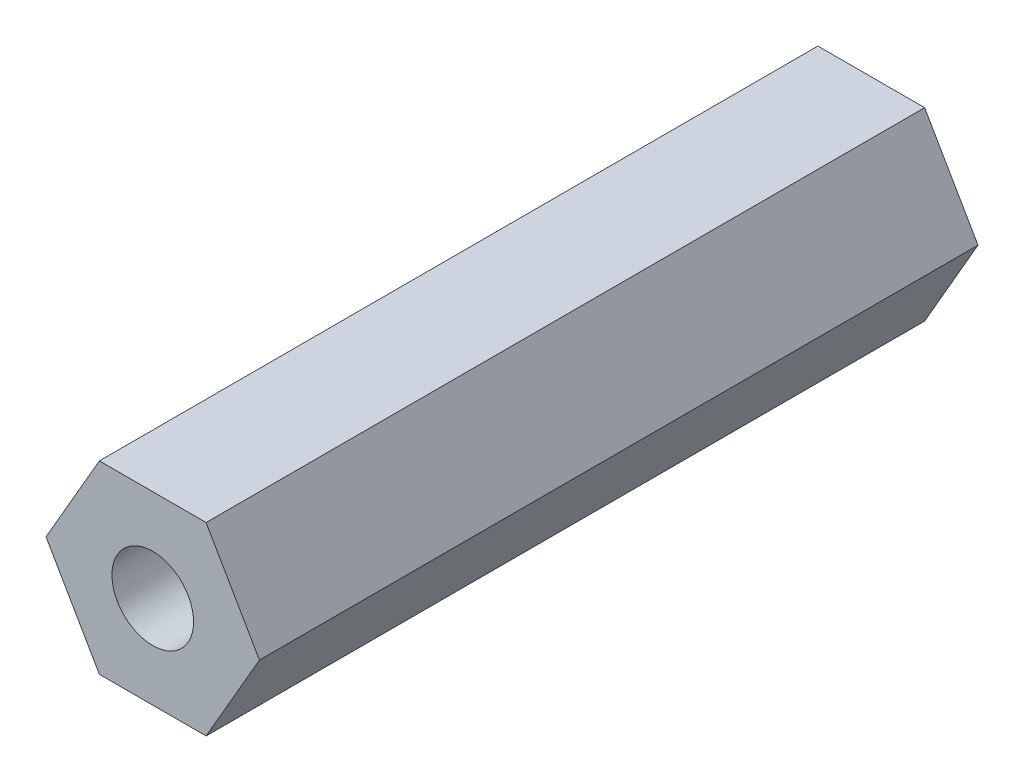
ISO-10303-21;
HEADER;
FILE_DESCRIPTION(('STEP AP214'),'2;1');
FILE_NAME('part.step','',(''),(''),'','','');
FILE_SCHEMA(('AUTOMOTIVE_DESIGN { 1 0 10303 214 1 1 1 1 }'));
ENDSEC;
DATA;
#1=APPLICATION_CONTEXT('core data for automotive mechanical design processes');
#2=APPLICATION_PROTOCOL_DEFINITION('international standard','automotive_design',2000,#1);
#3=PRODUCT_CONTEXT('',#1,'mechanical');
#4=PRODUCT('Part','Part','',(#3));
#5=PRODUCT_RELATED_PRODUCT_CATEGORY('part','',(#4));
#6=PRODUCT_DEFINITION_FORMATION('','',#4);
#7=PRODUCT_DEFINITION_CONTEXT('part definition',#1,'design');
#8=PRODUCT_DEFINITION('design','',#6,#7);
#9=PRODUCT_DEFINITION_SHAPE('','',#8);
#10=(LENGTH_UNIT() NAMED_UNIT(*) SI_UNIT(.MILLI.,.METRE.));
#11=(NAMED_UNIT(*) PLANE_ANGLE_UNIT() SI_UNIT($,.RADIAN.));
#12=(NAMED_UNIT(*) SI_UNIT($,.STERADIAN.) SOLID_ANGLE_UNIT());
#13=UNCERTAINTY_MEASURE_WITH_UNIT(LENGTH_MEASURE(1.E-05),#10,'distance_accuracy_value','');
#14=(GEOMETRIC_REPRESENTATION_CONTEXT(3) GLOBAL_UNCERTAINTY_ASSIGNED_CONTEXT((#13)) GLOBAL_UNIT_ASSIGNED_CONTEXT((#10,
#11,#12)) REPRESENTATION_CONTEXT('',''));
#15=CARTESIAN_POINT('',(0.,0.,0.));
#16=DIRECTION('',(0.,0.,1.));
#17=DIRECTION('',(1.,0.,0.));
#18=AXIS2_PLACEMENT_3D('',#15,#16,#17);
#19=CARTESIAN_POINT('',(0.,0.,-11.));
#20=DIRECTION('',(0.,0.,1.));
#21=DIRECTION('',(1.,0.,0.));
#22=AXIS2_PLACEMENT_3D('',#19,#20,#21);
#23=PLANE('',#22);
#24=DIRECTION('',(-0.5,0.866025403784439,0.));
#25=VECTOR('',#24,1.);
#26=CARTESIAN_POINT('',(3.26780252361328,0.,-11.));
#27=LINE('',#26,#25);
#28=CARTESIAN_POINT('',(3.26780252361328,0.,-11.));
#29=VERTEX_POINT('',#28);
#30=CARTESIAN_POINT('',(1.63390126180664,2.83,-11.));
#31=VERTEX_POINT('',#30);
#32=EDGE_CURVE('E125',#29,#31,#27,.T.);
#33=ORIENTED_EDGE('',*,*,#32,.F.);
#34=DIRECTION('',(0.5,0.866025403784439,0.));
#35=VECTOR('',#34,1.);
#36=CARTESIAN_POINT('',(1.63390126180664,-2.83,-11.));
#37=LINE('',#36,#35);
#38=CARTESIAN_POINT('',(1.63390126180664,-2.83,-11.));
#39=VERTEX_POINT('',#38);
#40=EDGE_CURVE('E86',#39,#29,#37,.T.);
#41=ORIENTED_EDGE('',*,*,#40,.F.);
#42=DIRECTION('',(1.,0.,0.));
#43=VECTOR('',#42,1.);
#44=CARTESIAN_POINT('',(-1.63390126180664,-2.83,-11.));
#45=LINE('',#44,#43);
#46=CARTESIAN_POINT('',(-1.63390126180664,-2.83,-11.));
#47=VERTEX_POINT('',#46);
#48=EDGE_CURVE('E80',#47,#39,#45,.T.);
#49=ORIENTED_EDGE('',*,*,#48,.F.);
#50=DIRECTION('',(0.5,-0.866025403784439,0.));
#51=VECTOR('',#50,1.);
#52=CARTESIAN_POINT('',(-3.26780252361328,0.,-11.));
#53=LINE('',#52,#51);
#54=CARTESIAN_POINT('',(-3.26780252361328,0.,-11.));
#55=VERTEX_POINT('',#54);
#56=EDGE_CURVE('E115',#55,#47,#53,.T.);
#57=ORIENTED_EDGE('',*,*,#56,.F.);
#58=DIRECTION('',(-0.5,-0.866025403784439,0.));
#59=VECTOR('',#58,1.);
#60=CARTESIAN_POINT('',(-1.63390126180664,2.83,-11.));
#61=LINE('',#60,#59);
#62=CARTESIAN_POINT('',(-1.63390126180664,2.83,-11.));
#63=VERTEX_POINT('',#62);
#64=EDGE_CURVE('E131',#63,#55,#61,.T.);
#65=ORIENTED_EDGE('',*,*,#64,.F.);
#66=DIRECTION('',(-1.,0.,0.));
#67=VECTOR('',#66,1.);
#68=CARTESIAN_POINT('',(1.63390126180664,2.83,-11.));
#69=LINE('',#68,#67);
#70=EDGE_CURVE('E128',#31,#63,#69,.T.);
#71=ORIENTED_EDGE('',*,*,#70,.F.);
#72=EDGE_LOOP('',(#33,#41,#49,#57,#65,#71));
#73=FACE_BOUND('',#72,.T.);
#74=CARTESIAN_POINT('',(0.,0.,-11.));
#75=DIRECTION('',(0.,0.,-1.));
#76=DIRECTION('',(-1.,0.,0.));
#77=AXIS2_PLACEMENT_3D('',#74,#75,#76);
#78=CIRCLE('',#77,1.25);
#79=CARTESIAN_POINT('',(-1.25,0.,-11.));
#80=VERTEX_POINT('',#79);
#81=EDGE_CURVE('E176',#80,#80,#78,.T.);
#82=ORIENTED_EDGE('',*,*,#81,.F.);
#83=EDGE_LOOP('',(#82));
#84=FACE_BOUND('',#83,.T.);
#85=ADVANCED_FACE('F40',(#73,#84),#23,.F.);
#86=CARTESIAN_POINT('',(3.26780252361328,0.,11.));
#87=DIRECTION('',(-0.866025403784439,-0.5,0.));
#88=DIRECTION('',(0.5,-0.866025403784439,0.));
#89=AXIS2_PLACEMENT_3D('',#86,#87,#88);
#90=PLANE('',#89);
#91=ORIENTED_EDGE('',*,*,#32,.T.);
#92=DIRECTION('',(0.,0.,-1.));
#93=VECTOR('',#92,1.);
#94=CARTESIAN_POINT('',(1.63390126180664,2.83,11.));
#95=LINE('',#94,#93);
#96=CARTESIAN_POINT('',(1.63390126180664,2.83,11.));
#97=VERTEX_POINT('',#96);
#98=EDGE_CURVE('E11',#97,#31,#95,.T.);
#99=ORIENTED_EDGE('',*,*,#98,.F.);
#100=DIRECTION('',(-0.5,0.866025403784439,0.));
#101=VECTOR('',#100,1.);
#102=CARTESIAN_POINT('',(3.26780252361328,0.,11.));
#103=LINE('',#102,#101);
#104=CARTESIAN_POINT('',(3.26780252361328,0.,11.));
#105=VERTEX_POINT('',#104);
#106=EDGE_CURVE('E136',#105,#97,#103,.T.);
#107=ORIENTED_EDGE('',*,*,#106,.F.);
#108=DIRECTION('',(0.,0.,-1.));
#109=VECTOR('',#108,1.);
#110=CARTESIAN_POINT('',(3.26780252361328,0.,11.));
#111=LINE('',#110,#109);
#112=EDGE_CURVE('E121',#105,#29,#111,.T.);
#113=ORIENTED_EDGE('',*,*,#112,.T.);
#114=EDGE_LOOP('',(#91,#99,#107,#113));
#115=FACE_BOUND('',#114,.T.);
#116=ADVANCED_FACE('F42',(#115),#90,.F.);
#117=CARTESIAN_POINT('',(1.63390126180664,2.83,11.));
#118=DIRECTION('',(0.,-1.,0.));
#119=DIRECTION('',(1.,0.,0.));
#120=AXIS2_PLACEMENT_3D('',#117,#118,#119);
#121=PLANE('',#120);
#122=ORIENTED_EDGE('',*,*,#70,.T.);
#123=DIRECTION('',(0.,0.,-1.));
#124=VECTOR('',#123,1.);
#125=CARTESIAN_POINT('',(-1.63390126180664,2.83,11.));
#126=LINE('',#125,#124);
#127=CARTESIAN_POINT('',(-1.63390126180664,2.83,11.));
#128=VERTEX_POINT('',#127);
#129=EDGE_CURVE('E49',#128,#63,#126,.T.);
#130=ORIENTED_EDGE('',*,*,#129,.F.);
#131=DIRECTION('',(-1.,0.,0.));
#132=VECTOR('',#131,1.);
#133=CARTESIAN_POINT('',(1.63390126180664,2.83,11.));
#134=LINE('',#133,#132);
#135=EDGE_CURVE('E94',#97,#128,#134,.T.);
#136=ORIENTED_EDGE('',*,*,#135,.F.);
#137=ORIENTED_EDGE('',*,*,#98,.T.);
#138=EDGE_LOOP('',(#122,#130,#136,#137));
#139=FACE_BOUND('',#138,.T.);
#140=ADVANCED_FACE('F165',(#139),#121,.F.);
#141=CARTESIAN_POINT('',(-1.63390126180664,2.83,11.));
#142=DIRECTION('',(0.866025403784439,-0.5,0.));
#143=DIRECTION('',(0.5,0.866025403784439,0.));
#144=AXIS2_PLACEMENT_3D('',#141,#142,#143);
#145=PLANE('',#144);
#146=ORIENTED_EDGE('',*,*,#64,.T.);
#147=DIRECTION('',(0.,0.,-1.));
#148=VECTOR('',#147,1.);
#149=CARTESIAN_POINT('',(-3.26780252361328,0.,11.));
#150=LINE('',#149,#148);
#151=CARTESIAN_POINT('',(-3.26780252361328,0.,11.));
#152=VERTEX_POINT('',#151);
#153=EDGE_CURVE('E116',#152,#55,#150,.T.);
#154=ORIENTED_EDGE('',*,*,#153,.F.);
#155=DIRECTION('',(-0.5,-0.866025403784439,0.));
#156=VECTOR('',#155,1.);
#157=CARTESIAN_POINT('',(-1.63390126180664,2.83,11.));
#158=LINE('',#157,#156);
#159=EDGE_CURVE('E107',#128,#152,#158,.T.);
#160=ORIENTED_EDGE('',*,*,#159,.F.);
#161=ORIENTED_EDGE('',*,*,#129,.T.);
#162=EDGE_LOOP('',(#146,#154,#160,#161));
#163=FACE_BOUND('',#162,.T.);
#164=ADVANCED_FACE('F142',(#163),#145,.F.);
#165=CARTESIAN_POINT('',(-3.26780252361328,0.,11.));
#166=DIRECTION('',(0.866025403784438,0.5,0.));
#167=DIRECTION('',(-0.5,0.866025403784439,0.));
#168=AXIS2_PLACEMENT_3D('',#165,#166,#167);
#169=PLANE('',#168);
#170=ORIENTED_EDGE('',*,*,#56,.T.);
#171=DIRECTION('',(0.,0.,-1.));
#172=VECTOR('',#171,1.);
#173=CARTESIAN_POINT('',(-1.63390126180664,-2.83,11.));
#174=LINE('',#173,#172);
#175=CARTESIAN_POINT('',(-1.63390126180664,-2.83,11.));
#176=VERTEX_POINT('',#175);
#177=EDGE_CURVE('E112',#176,#47,#174,.T.);
#178=ORIENTED_EDGE('',*,*,#177,.F.);
#179=DIRECTION('',(0.5,-0.866025403784439,0.));
#180=VECTOR('',#179,1.);
#181=CARTESIAN_POINT('',(-3.26780252361328,0.,11.));
#182=LINE('',#181,#180);
#183=EDGE_CURVE('E101',#152,#176,#182,.T.);
#184=ORIENTED_EDGE('',*,*,#183,.F.);
#185=ORIENTED_EDGE('',*,*,#153,.T.);
#186=EDGE_LOOP('',(#170,#178,#184,#185));
#187=FACE_BOUND('',#186,.T.);
#188=ADVANCED_FACE('F113',(#187),#169,.F.);
#189=CARTESIAN_POINT('',(-1.63390126180664,-2.83,11.));
#190=DIRECTION('',(0.,1.,0.));
#191=DIRECTION('',(0.,0.,1.));
#192=AXIS2_PLACEMENT_3D('',#189,#190,#191);
#193=PLANE('',#192);
#194=ORIENTED_EDGE('',*,*,#48,.T.);
#195=DIRECTION('',(0.,0.,-1.));
#196=VECTOR('',#195,1.);
#197=CARTESIAN_POINT('',(1.63390126180664,-2.83,11.));
#198=LINE('',#197,#196);
#199=CARTESIAN_POINT('',(1.63390126180664,-2.83,11.));
#200=VERTEX_POINT('',#199);
#201=EDGE_CURVE('E117',#200,#39,#198,.T.);
#202=ORIENTED_EDGE('',*,*,#201,.F.);
#203=DIRECTION('',(1.,0.,0.));
#204=VECTOR('',#203,1.);
#205=CARTESIAN_POINT('',(-1.63390126180664,-2.83,11.));
#206=LINE('',#205,#204);
#207=EDGE_CURVE('E105',#176,#200,#206,.T.);
#208=ORIENTED_EDGE('',*,*,#207,.F.);
#209=ORIENTED_EDGE('',*,*,#177,.T.);
#210=EDGE_LOOP('',(#194,#202,#208,#209));
#211=FACE_BOUND('',#210,.T.);
#212=ADVANCED_FACE('F119',(#211),#193,.F.);
#213=CARTESIAN_POINT('',(1.63390126180664,-2.83,11.));
#214=DIRECTION('',(-0.866025403784439,0.5,0.));
#215=DIRECTION('',(-0.5,-0.866025403784439,0.));
#216=AXIS2_PLACEMENT_3D('',#213,#214,#215);
#217=PLANE('',#216);
#218=ORIENTED_EDGE('',*,*,#40,.T.);
#219=ORIENTED_EDGE('',*,*,#112,.F.);
#220=DIRECTION('',(0.5,0.866025403784439,0.));
#221=VECTOR('',#220,1.);
#222=CARTESIAN_POINT('',(1.63390126180664,-2.83,11.));
#223=LINE('',#222,#221);
#224=EDGE_CURVE('E57',#200,#105,#223,.T.);
#225=ORIENTED_EDGE('',*,*,#224,.F.);
#226=ORIENTED_EDGE('',*,*,#201,.T.);
#227=EDGE_LOOP('',(#218,#219,#225,#226));
#228=FACE_BOUND('',#227,.T.);
#229=ADVANCED_FACE('F149',(#228),#217,.F.);
#230=CARTESIAN_POINT('',(0.,0.,11.));
#231=DIRECTION('',(0.,0.,1.));
#232=DIRECTION('',(1.,0.,0.));
#233=AXIS2_PLACEMENT_3D('',#230,#231,#232);
#234=PLANE('',#233);
#235=CARTESIAN_POINT('',(0.,0.,11.));
#236=DIRECTION('',(0.,0.,1.));
#237=DIRECTION('',(1.,0.,0.));
#238=AXIS2_PLACEMENT_3D('',#235,#236,#237);
#239=CIRCLE('',#238,1.25);
#240=CARTESIAN_POINT('',(1.25,0.,11.));
#241=VERTEX_POINT('',#240);
#242=EDGE_CURVE('E129',#241,#241,#239,.T.);
#243=ORIENTED_EDGE('',*,*,#242,.F.);
#244=EDGE_LOOP('',(#243));
#245=FACE_BOUND('',#244,.T.);
#246=ORIENTED_EDGE('',*,*,#106,.T.);
#247=ORIENTED_EDGE('',*,*,#135,.T.);
#248=ORIENTED_EDGE('',*,*,#159,.T.);
#249=ORIENTED_EDGE('',*,*,#183,.T.);
#250=ORIENTED_EDGE('',*,*,#207,.T.);
#251=ORIENTED_EDGE('',*,*,#224,.T.);
#252=EDGE_LOOP('',(#246,#247,#248,#249,#250,#251));
#253=FACE_BOUND('',#252,.T.);
#254=ADVANCED_FACE('F103',(#245,#253),#234,.T.);
#255=CARTESIAN_POINT('',(0.,0.,11.));
#256=DIRECTION('',(0.,0.,1.));
#257=DIRECTION('',(1.,0.,0.));
#258=AXIS2_PLACEMENT_3D('',#255,#256,#257);
#259=CYLINDRICAL_SURFACE('',#258,1.25);
#260=ORIENTED_EDGE('',*,*,#242,.T.);
#261=EDGE_LOOP('',(#260));
#262=FACE_BOUND('',#261,.T.);
#263=ORIENTED_EDGE('',*,*,#81,.T.);
#264=EDGE_LOOP('',(#263));
#265=FACE_BOUND('',#264,.T.);
#266=ADVANCED_FACE('F156',(#262,#265),#259,.F.);
#267=CLOSED_SHELL('',(#85,#116,#140,#164,#188,#212,#229,#254,#266));
#268=MANIFOLD_SOLID_BREP('B2',#267);
#269=ADVANCED_BREP_SHAPE_REPRESENTATION('',(#18,#268),#14);
#270=SHAPE_DEFINITION_REPRESENTATION(#9,#269);
ENDSEC;
END-ISO-10303-21;
